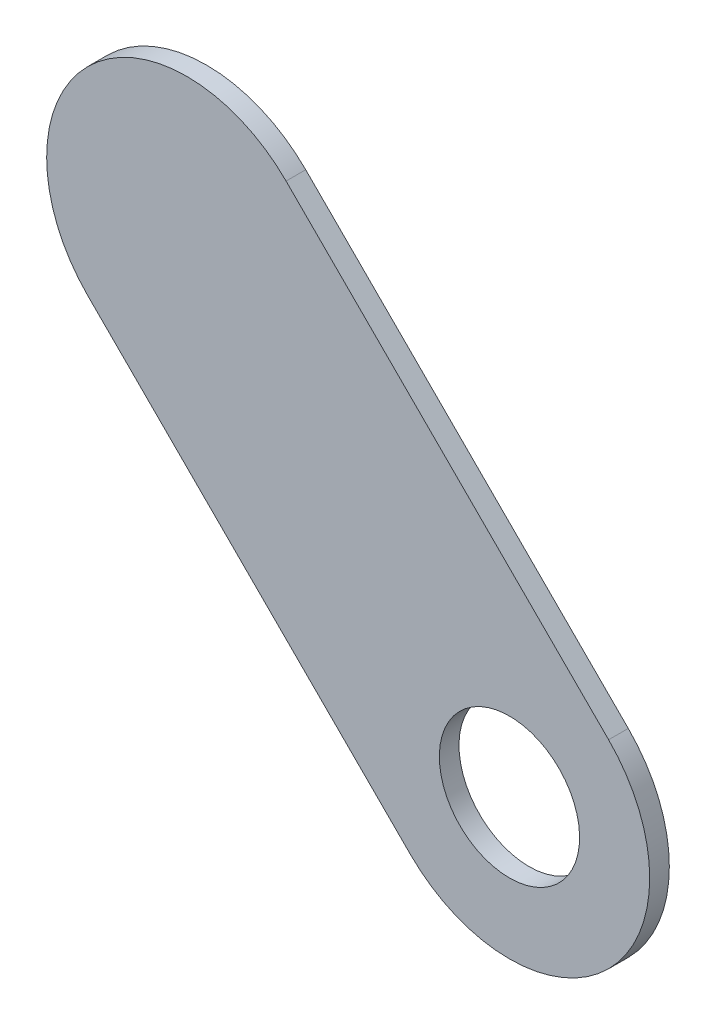
ISO-10303-21;
HEADER;
FILE_DESCRIPTION(('STEP AP214'),'2;1');
FILE_NAME('part.step','',(''),(''),'','','');
FILE_SCHEMA(('AUTOMOTIVE_DESIGN { 1 0 10303 214 1 1 1 1 }'));
ENDSEC;
DATA;
#1=APPLICATION_CONTEXT('core data for automotive mechanical design processes');
#2=APPLICATION_PROTOCOL_DEFINITION('international standard','automotive_design',2000,#1);
#3=PRODUCT_CONTEXT('',#1,'mechanical');
#4=PRODUCT('Part','Part','',(#3));
#5=PRODUCT_RELATED_PRODUCT_CATEGORY('part','',(#4));
#6=PRODUCT_DEFINITION_FORMATION('','',#4);
#7=PRODUCT_DEFINITION_CONTEXT('part definition',#1,'design');
#8=PRODUCT_DEFINITION('design','',#6,#7);
#9=PRODUCT_DEFINITION_SHAPE('','',#8);
#10=(LENGTH_UNIT() NAMED_UNIT(*) SI_UNIT(.MILLI.,.METRE.));
#11=(NAMED_UNIT(*) PLANE_ANGLE_UNIT() SI_UNIT($,.RADIAN.));
#12=(NAMED_UNIT(*) SI_UNIT($,.STERADIAN.) SOLID_ANGLE_UNIT());
#13=UNCERTAINTY_MEASURE_WITH_UNIT(LENGTH_MEASURE(1.E-05),#10,'distance_accuracy_value','');
#14=(GEOMETRIC_REPRESENTATION_CONTEXT(3) GLOBAL_UNCERTAINTY_ASSIGNED_CONTEXT((#13)) GLOBAL_UNIT_ASSIGNED_CONTEXT((#10,
#11,#12)) REPRESENTATION_CONTEXT('',''));
#15=CARTESIAN_POINT('',(0.,0.,0.));
#16=DIRECTION('',(0.,0.,1.));
#17=DIRECTION('',(1.,0.,0.));
#18=AXIS2_PLACEMENT_3D('',#15,#16,#17);
#19=CARTESIAN_POINT('',(87.7,-124.4,-0.045));
#20=DIRECTION('',(0.,0.,-1.));
#21=DIRECTION('',(0.,-1.,0.));
#22=AXIS2_PLACEMENT_3D('',#19,#20,#21);
#23=CYLINDRICAL_SURFACE('',#22,0.125);
#24=CARTESIAN_POINT('',(87.7,-124.4,1.6));
#25=DIRECTION('',(0.,0.,-1.));
#26=DIRECTION('',(0.,-1.,0.));
#27=AXIS2_PLACEMENT_3D('',#24,#25,#26);
#28=CIRCLE('',#27,0.125);
#29=CARTESIAN_POINT('',(87.7,-124.525,1.6));
#30=VERTEX_POINT('',#29);
#31=EDGE_CURVE('E86',#30,#30,#28,.T.);
#32=ORIENTED_EDGE('',*,*,#31,.T.);
#33=DIRECTION('',(0.,0.,1.));
#34=VECTOR('',#33,1.);
#35=CARTESIAN_POINT('',(87.7,-124.525,-0.045));
#36=LINE('',#35,#34);
#37=CARTESIAN_POINT('',(87.7,-124.525,1.635));
#38=VERTEX_POINT('',#37);
#39=EDGE_CURVE('E11',#30,#38,#36,.T.);
#40=ORIENTED_EDGE('',*,*,#39,.T.);
#41=CARTESIAN_POINT('',(87.7,-124.4,1.635));
#42=DIRECTION('',(0.,0.,-1.));
#43=DIRECTION('',(0.,-1.,0.));
#44=AXIS2_PLACEMENT_3D('',#41,#42,#43);
#45=CIRCLE('',#44,0.125);
#46=EDGE_CURVE('E25',#38,#38,#45,.T.);
#47=ORIENTED_EDGE('',*,*,#46,.F.);
#48=ORIENTED_EDGE('',*,*,#39,.F.);
#49=EDGE_LOOP('',(#32,#40,#47,#48));
#50=FACE_BOUND('',#49,.T.);
#51=ADVANCED_FACE('F17',(#50),#23,.F.);
#52=CARTESIAN_POINT('',(87.876776,-124.223223,1.6));
#53=DIRECTION('',(-0.707106781186548,-0.707106781186548,0.));
#54=DIRECTION('',(-0.707106781186548,0.707106781186548,0.));
#55=AXIS2_PLACEMENT_3D('',#52,#53,#54);
#56=PLANE('',#55);
#57=DIRECTION('',(-0.707106781186548,0.707106781186548,0.));
#58=VECTOR('',#57,1.);
#59=CARTESIAN_POINT('',(87.876776,-124.223223,1.6));
#60=LINE('',#59,#58);
#61=CARTESIAN_POINT('',(87.876776,-124.223223,1.6));
#62=VERTEX_POINT('',#61);
#63=CARTESIAN_POINT('',(87.301776,-123.648223,1.6));
#64=VERTEX_POINT('',#63);
#65=EDGE_CURVE('E91',#62,#64,#60,.T.);
#66=ORIENTED_EDGE('',*,*,#65,.T.);
#67=DIRECTION('',(0.,0.,1.));
#68=VECTOR('',#67,1.);
#69=CARTESIAN_POINT('',(87.301776,-123.648223,1.6));
#70=LINE('',#69,#68);
#71=CARTESIAN_POINT('',(87.301776,-123.648223,1.635));
#72=VERTEX_POINT('',#71);
#73=EDGE_CURVE('E89',#64,#72,#70,.T.);
#74=ORIENTED_EDGE('',*,*,#73,.T.);
#75=DIRECTION('',(-0.707106781186548,0.707106781186548,0.));
#76=VECTOR('',#75,1.);
#77=CARTESIAN_POINT('',(87.876776,-124.223223,1.635));
#78=LINE('',#77,#76);
#79=CARTESIAN_POINT('',(87.876776,-124.223223,1.635));
#80=VERTEX_POINT('',#79);
#81=EDGE_CURVE('E74',#80,#72,#78,.T.);
#82=ORIENTED_EDGE('',*,*,#81,.F.);
#83=DIRECTION('',(0.,0.,1.));
#84=VECTOR('',#83,1.);
#85=CARTESIAN_POINT('',(87.876776,-124.223223,1.6));
#86=LINE('',#85,#84);
#87=EDGE_CURVE('E115',#62,#80,#86,.T.);
#88=ORIENTED_EDGE('',*,*,#87,.F.);
#89=EDGE_LOOP('',(#66,#74,#82,#88));
#90=FACE_BOUND('',#89,.T.);
#91=ADVANCED_FACE('F90',(#90),#56,.F.);
#92=CARTESIAN_POINT('',(86.948223,-124.001776,1.635));
#93=DIRECTION('',(0.,0.,1.));
#94=DIRECTION('',(1.,0.,0.));
#95=AXIS2_PLACEMENT_3D('',#92,#93,#94);
#96=PLANE('',#95);
#97=ORIENTED_EDGE('',*,*,#46,.T.);
#98=EDGE_LOOP('',(#97));
#99=FACE_BOUND('',#98,.T.);
#100=DIRECTION('',(0.707106781186548,-0.707106781186548,0.));
#101=VECTOR('',#100,1.);
#102=CARTESIAN_POINT('',(86.948223,-124.001776,1.635));
#103=LINE('',#102,#101);
#104=CARTESIAN_POINT('',(86.948223,-124.001776,1.635));
#105=VERTEX_POINT('',#104);
#106=CARTESIAN_POINT('',(87.523223,-124.576776,1.635));
#107=VERTEX_POINT('',#106);
#108=EDGE_CURVE('E166',#105,#107,#103,.T.);
#109=ORIENTED_EDGE('',*,*,#108,.T.);
#110=CARTESIAN_POINT('',(87.6999995,-124.3999995,1.635));
#111=DIRECTION('',(0.,0.,1.));
#112=DIRECTION('',(-0.707106781186548,-0.707106781186548,0.));
#113=AXIS2_PLACEMENT_3D('',#110,#111,#112);
#114=CIRCLE('',#113,0.249999723809);
#115=EDGE_CURVE('E81',#107,#80,#114,.T.);
#116=ORIENTED_EDGE('',*,*,#115,.T.);
#117=ORIENTED_EDGE('',*,*,#81,.T.);
#118=CARTESIAN_POINT('',(87.1249995,-123.8249995,1.635));
#119=DIRECTION('',(0.,0.,1.));
#120=DIRECTION('',(0.707106781186548,0.707106781186548,0.));
#121=AXIS2_PLACEMENT_3D('',#118,#119,#120);
#122=CIRCLE('',#121,0.249999723809);
#123=EDGE_CURVE('E79',#72,#105,#122,.T.);
#124=ORIENTED_EDGE('',*,*,#123,.T.);
#125=EDGE_LOOP('',(#109,#116,#117,#124));
#126=FACE_BOUND('',#125,.T.);
#127=ADVANCED_FACE('F77',(#99,#126),#96,.T.);
#128=CARTESIAN_POINT('',(86.948223,-124.001776,1.6));
#129=DIRECTION('',(0.,0.,1.));
#130=DIRECTION('',(1.,0.,0.));
#131=AXIS2_PLACEMENT_3D('',#128,#129,#130);
#132=PLANE('',#131);
#133=ORIENTED_EDGE('',*,*,#31,.F.);
#134=EDGE_LOOP('',(#133));
#135=FACE_BOUND('',#134,.T.);
#136=CARTESIAN_POINT('',(87.1249995,-123.8249995,1.6));
#137=DIRECTION('',(0.,0.,1.));
#138=DIRECTION('',(0.707106781186548,0.707106781186548,0.));
#139=AXIS2_PLACEMENT_3D('',#136,#137,#138);
#140=CIRCLE('',#139,0.249999723809);
#141=CARTESIAN_POINT('',(86.948223,-124.001776,1.6));
#142=VERTEX_POINT('',#141);
#143=EDGE_CURVE('E102',#64,#142,#140,.T.);
#144=ORIENTED_EDGE('',*,*,#143,.F.);
#145=ORIENTED_EDGE('',*,*,#65,.F.);
#146=CARTESIAN_POINT('',(87.6999995,-124.3999995,1.6));
#147=DIRECTION('',(0.,0.,1.));
#148=DIRECTION('',(-0.707106781186548,-0.707106781186548,0.));
#149=AXIS2_PLACEMENT_3D('',#146,#147,#148);
#150=CIRCLE('',#149,0.249999723809);
#151=CARTESIAN_POINT('',(87.523223,-124.576776,1.6));
#152=VERTEX_POINT('',#151);
#153=EDGE_CURVE('E95',#152,#62,#150,.T.);
#154=ORIENTED_EDGE('',*,*,#153,.F.);
#155=DIRECTION('',(0.707106781186548,-0.707106781186548,0.));
#156=VECTOR('',#155,1.);
#157=CARTESIAN_POINT('',(86.948223,-124.001776,1.6));
#158=LINE('',#157,#156);
#159=EDGE_CURVE('E157',#142,#152,#158,.T.);
#160=ORIENTED_EDGE('',*,*,#159,.F.);
#161=EDGE_LOOP('',(#144,#145,#154,#160));
#162=FACE_BOUND('',#161,.T.);
#163=ADVANCED_FACE('F136',(#135,#162),#132,.F.);
#164=CARTESIAN_POINT('',(87.6999995,-124.3999995,1.6));
#165=DIRECTION('',(0.,0.,-1.));
#166=DIRECTION('',(-0.707106781186548,-0.707106781186548,0.));
#167=AXIS2_PLACEMENT_3D('',#164,#165,#166);
#168=CYLINDRICAL_SURFACE('',#167,0.249999723809);
#169=ORIENTED_EDGE('',*,*,#153,.T.);
#170=ORIENTED_EDGE('',*,*,#87,.T.);
#171=ORIENTED_EDGE('',*,*,#115,.F.);
#172=DIRECTION('',(0.,0.,1.));
#173=VECTOR('',#172,1.);
#174=CARTESIAN_POINT('',(87.523223,-124.576776,1.6));
#175=LINE('',#174,#173);
#176=EDGE_CURVE('E159',#152,#107,#175,.T.);
#177=ORIENTED_EDGE('',*,*,#176,.F.);
#178=EDGE_LOOP('',(#169,#170,#171,#177));
#179=FACE_BOUND('',#178,.T.);
#180=ADVANCED_FACE('F141',(#179),#168,.T.);
#181=CARTESIAN_POINT('',(87.1249995,-123.8249995,1.6));
#182=DIRECTION('',(0.,0.,-1.));
#183=DIRECTION('',(0.707106781186548,0.707106781186548,0.));
#184=AXIS2_PLACEMENT_3D('',#181,#182,#183);
#185=CYLINDRICAL_SURFACE('',#184,0.249999723809);
#186=ORIENTED_EDGE('',*,*,#143,.T.);
#187=DIRECTION('',(0.,0.,1.));
#188=VECTOR('',#187,1.);
#189=CARTESIAN_POINT('',(86.948223,-124.001776,1.6));
#190=LINE('',#189,#188);
#191=EDGE_CURVE('E99',#142,#105,#190,.T.);
#192=ORIENTED_EDGE('',*,*,#191,.T.);
#193=ORIENTED_EDGE('',*,*,#123,.F.);
#194=ORIENTED_EDGE('',*,*,#73,.F.);
#195=EDGE_LOOP('',(#186,#192,#193,#194));
#196=FACE_BOUND('',#195,.T.);
#197=ADVANCED_FACE('F97',(#196),#185,.T.);
#198=CARTESIAN_POINT('',(86.948223,-124.001776,1.6));
#199=DIRECTION('',(0.707106781186548,0.707106781186548,0.));
#200=DIRECTION('',(0.,0.,-1.));
#201=AXIS2_PLACEMENT_3D('',#198,#199,#200);
#202=PLANE('',#201);
#203=ORIENTED_EDGE('',*,*,#159,.T.);
#204=ORIENTED_EDGE('',*,*,#176,.T.);
#205=ORIENTED_EDGE('',*,*,#108,.F.);
#206=ORIENTED_EDGE('',*,*,#191,.F.);
#207=EDGE_LOOP('',(#203,#204,#205,#206));
#208=FACE_BOUND('',#207,.T.);
#209=ADVANCED_FACE('F148',(#208),#202,.F.);
#210=CLOSED_SHELL('',(#51,#91,#127,#163,#180,#197,#209));
#211=MANIFOLD_SOLID_BREP('B1',#210);
#212=ADVANCED_BREP_SHAPE_REPRESENTATION('',(#18,#211),#14);
#213=SHAPE_DEFINITION_REPRESENTATION(#9,#212);
ENDSEC;
END-ISO-10303-21;
